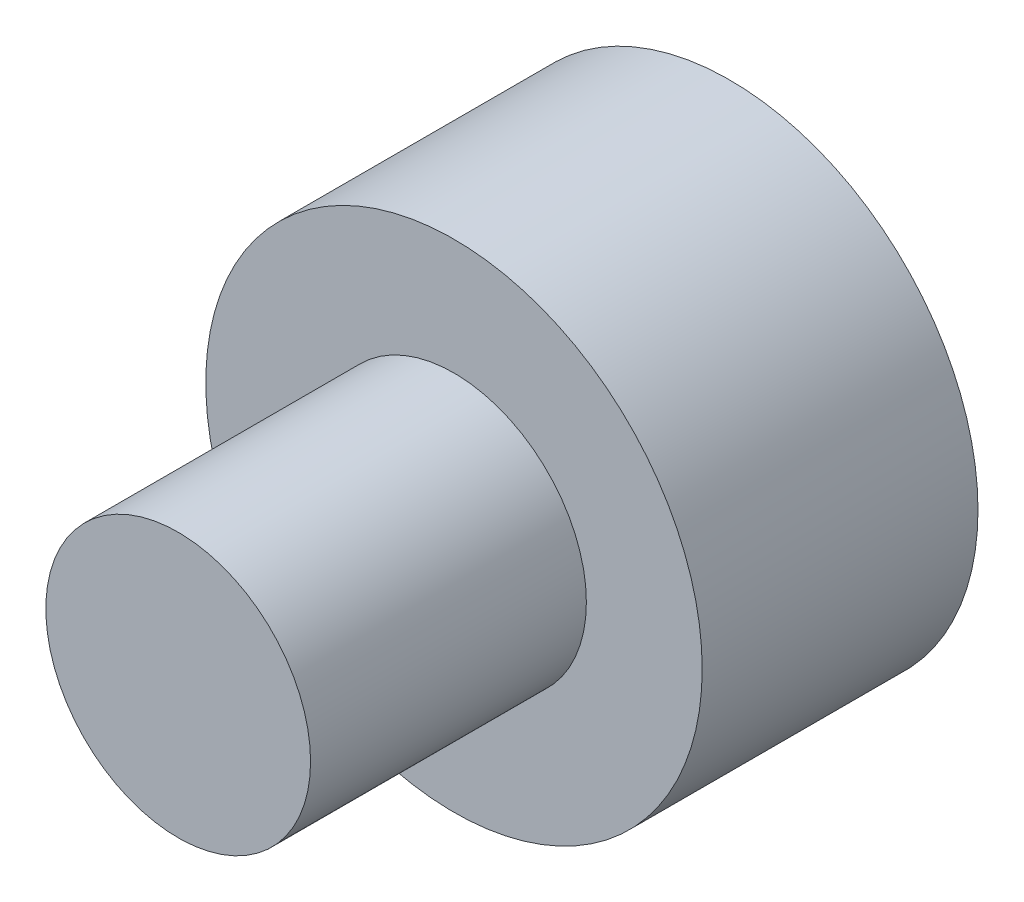
ISO-10303-21;
HEADER;
FILE_DESCRIPTION(('STEP AP214'),'2;1');
FILE_NAME('part.step','',(''),(''),'','','');
FILE_SCHEMA(('AUTOMOTIVE_DESIGN { 1 0 10303 214 1 1 1 1 }'));
ENDSEC;
DATA;
#1=APPLICATION_CONTEXT('core data for automotive mechanical design processes');
#2=APPLICATION_PROTOCOL_DEFINITION('international standard','automotive_design',2000,#1);
#3=PRODUCT_CONTEXT('',#1,'mechanical');
#4=PRODUCT('Part','Part','',(#3));
#5=PRODUCT_RELATED_PRODUCT_CATEGORY('part','',(#4));
#6=PRODUCT_DEFINITION_FORMATION('','',#4);
#7=PRODUCT_DEFINITION_CONTEXT('part definition',#1,'design');
#8=PRODUCT_DEFINITION('design','',#6,#7);
#9=PRODUCT_DEFINITION_SHAPE('','',#8);
#10=(LENGTH_UNIT() NAMED_UNIT(*) SI_UNIT(.MILLI.,.METRE.));
#11=(NAMED_UNIT(*) PLANE_ANGLE_UNIT() SI_UNIT($,.RADIAN.));
#12=(NAMED_UNIT(*) SI_UNIT($,.STERADIAN.) SOLID_ANGLE_UNIT());
#13=UNCERTAINTY_MEASURE_WITH_UNIT(LENGTH_MEASURE(1.E-05),#10,'distance_accuracy_value','');
#14=(GEOMETRIC_REPRESENTATION_CONTEXT(3) GLOBAL_UNCERTAINTY_ASSIGNED_CONTEXT((#13)) GLOBAL_UNIT_ASSIGNED_CONTEXT((#10,
#11,#12)) REPRESENTATION_CONTEXT('',''));
#15=CARTESIAN_POINT('',(0.,0.,0.));
#16=DIRECTION('',(0.,0.,1.));
#17=DIRECTION('',(1.,0.,0.));
#18=AXIS2_PLACEMENT_3D('',#15,#16,#17);
#19=CARTESIAN_POINT('',(0.,0.,2.5));
#20=DIRECTION('',(0.,0.,-1.));
#21=DIRECTION('',(-1.,0.,0.));
#22=AXIS2_PLACEMENT_3D('',#19,#20,#21);
#23=CYLINDRICAL_SURFACE('',#22,2.25);
#24=CARTESIAN_POINT('',(0.,0.,2.5));
#25=DIRECTION('',(0.,0.,1.));
#26=DIRECTION('',(1.,0.,0.));
#27=AXIS2_PLACEMENT_3D('',#24,#25,#26);
#28=CIRCLE('',#27,2.25);
#29=CARTESIAN_POINT('',(2.25,0.,2.5));
#30=VERTEX_POINT('',#29);
#31=EDGE_CURVE('E51',#30,#30,#28,.T.);
#32=ORIENTED_EDGE('',*,*,#31,.F.);
#33=EDGE_LOOP('',(#32));
#34=FACE_BOUND('',#33,.T.);
#35=CARTESIAN_POINT('',(0.,0.,0.));
#36=DIRECTION('',(0.,0.,1.));
#37=DIRECTION('',(1.,0.,0.));
#38=AXIS2_PLACEMENT_3D('',#35,#36,#37);
#39=CIRCLE('',#38,2.25);
#40=CARTESIAN_POINT('',(2.25,0.,0.));
#41=VERTEX_POINT('',#40);
#42=EDGE_CURVE('E46',#41,#41,#39,.T.);
#43=ORIENTED_EDGE('',*,*,#42,.T.);
#44=EDGE_LOOP('',(#43));
#45=FACE_BOUND('',#44,.T.);
#46=ADVANCED_FACE('F43',(#34,#45),#23,.T.);
#47=CARTESIAN_POINT('',(0.,0.,2.5));
#48=DIRECTION('',(0.,0.,1.));
#49=DIRECTION('',(1.,0.,0.));
#50=AXIS2_PLACEMENT_3D('',#47,#48,#49);
#51=PLANE('',#50);
#52=CARTESIAN_POINT('',(0.,0.,2.5));
#53=DIRECTION('',(0.,0.,1.));
#54=DIRECTION('',(1.,0.,0.));
#55=AXIS2_PLACEMENT_3D('',#52,#53,#54);
#56=CIRCLE('',#55,1.2);
#57=CARTESIAN_POINT('',(1.2,0.,2.5));
#58=VERTEX_POINT('',#57);
#59=EDGE_CURVE('E10',#58,#58,#56,.T.);
#60=ORIENTED_EDGE('',*,*,#59,.F.);
#61=EDGE_LOOP('',(#60));
#62=FACE_BOUND('',#61,.T.);
#63=ORIENTED_EDGE('',*,*,#31,.T.);
#64=EDGE_LOOP('',(#63));
#65=FACE_BOUND('',#64,.T.);
#66=ADVANCED_FACE('F71',(#62,#65),#51,.T.);
#67=CARTESIAN_POINT('',(0.,0.,0.));
#68=DIRECTION('',(0.,0.,1.));
#69=DIRECTION('',(1.,0.,0.));
#70=AXIS2_PLACEMENT_3D('',#67,#68,#69);
#71=PLANE('',#70);
#72=ORIENTED_EDGE('',*,*,#42,.F.);
#73=EDGE_LOOP('',(#72));
#74=FACE_BOUND('',#73,.T.);
#75=ADVANCED_FACE('F68',(#74),#71,.F.);
#76=CARTESIAN_POINT('',(0.,0.,5.));
#77=DIRECTION('',(0.,0.,-1.));
#78=DIRECTION('',(-1.,0.,0.));
#79=AXIS2_PLACEMENT_3D('',#76,#77,#78);
#80=CYLINDRICAL_SURFACE('',#79,1.2);
#81=CARTESIAN_POINT('',(0.,0.,5.));
#82=DIRECTION('',(0.,0.,1.));
#83=DIRECTION('',(1.,0.,0.));
#84=AXIS2_PLACEMENT_3D('',#81,#82,#83);
#85=CIRCLE('',#84,1.2);
#86=CARTESIAN_POINT('',(1.2,0.,5.));
#87=VERTEX_POINT('',#86);
#88=EDGE_CURVE('E58',#87,#87,#85,.T.);
#89=ORIENTED_EDGE('',*,*,#88,.F.);
#90=EDGE_LOOP('',(#89));
#91=FACE_BOUND('',#90,.T.);
#92=ORIENTED_EDGE('',*,*,#59,.T.);
#93=EDGE_LOOP('',(#92));
#94=FACE_BOUND('',#93,.T.);
#95=ADVANCED_FACE('F70',(#91,#94),#80,.T.);
#96=CARTESIAN_POINT('',(0.,0.,5.));
#97=DIRECTION('',(0.,0.,1.));
#98=DIRECTION('',(1.,0.,0.));
#99=AXIS2_PLACEMENT_3D('',#96,#97,#98);
#100=PLANE('',#99);
#101=ORIENTED_EDGE('',*,*,#88,.T.);
#102=EDGE_LOOP('',(#101));
#103=FACE_BOUND('',#102,.T.);
#104=ADVANCED_FACE('F77',(#103),#100,.T.);
#105=CLOSED_SHELL('',(#46,#66,#75,#95,#104));
#106=MANIFOLD_SOLID_BREP('B2',#105);
#107=ADVANCED_BREP_SHAPE_REPRESENTATION('',(#18,#106),#14);
#108=SHAPE_DEFINITION_REPRESENTATION(#9,#107);
ENDSEC;
END-ISO-10303-21;
